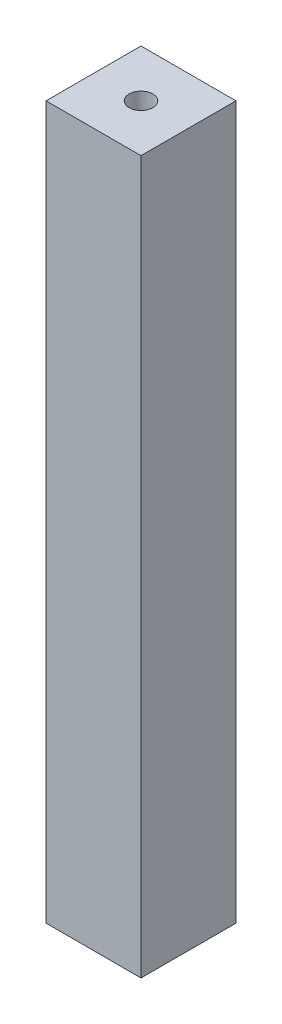
ISO-10303-21;
HEADER;
FILE_DESCRIPTION(('STEP AP214'),'2;1');
FILE_NAME('part.step','',(''),(''),'','','');
FILE_SCHEMA(('AUTOMOTIVE_DESIGN { 1 0 10303 214 1 1 1 1 }'));
ENDSEC;
DATA;
#1=APPLICATION_CONTEXT('core data for automotive mechanical design processes');
#2=APPLICATION_PROTOCOL_DEFINITION('international standard','automotive_design',2000,#1);
#3=PRODUCT_CONTEXT('',#1,'mechanical');
#4=PRODUCT('Part','Part','',(#3));
#5=PRODUCT_RELATED_PRODUCT_CATEGORY('part','',(#4));
#6=PRODUCT_DEFINITION_FORMATION('','',#4);
#7=PRODUCT_DEFINITION_CONTEXT('part definition',#1,'design');
#8=PRODUCT_DEFINITION('design','',#6,#7);
#9=PRODUCT_DEFINITION_SHAPE('','',#8);
#10=(LENGTH_UNIT() NAMED_UNIT(*) SI_UNIT(.MILLI.,.METRE.));
#11=(NAMED_UNIT(*) PLANE_ANGLE_UNIT() SI_UNIT($,.RADIAN.));
#12=(NAMED_UNIT(*) SI_UNIT($,.STERADIAN.) SOLID_ANGLE_UNIT());
#13=UNCERTAINTY_MEASURE_WITH_UNIT(LENGTH_MEASURE(1.E-05),#10,'distance_accuracy_value','');
#14=(GEOMETRIC_REPRESENTATION_CONTEXT(3) GLOBAL_UNCERTAINTY_ASSIGNED_CONTEXT((#13)) GLOBAL_UNIT_ASSIGNED_CONTEXT((#10,
#11,#12)) REPRESENTATION_CONTEXT('',''));
#15=CARTESIAN_POINT('',(0.,0.,0.));
#16=DIRECTION('',(0.,0.,1.));
#17=DIRECTION('',(1.,0.,0.));
#18=AXIS2_PLACEMENT_3D('',#15,#16,#17);
#19=CARTESIAN_POINT('',(0.,150.,0.));
#20=DIRECTION('',(0.,-1.,0.));
#21=DIRECTION('',(0.,0.,-1.));
#22=AXIS2_PLACEMENT_3D('',#19,#20,#21);
#23=PLANE('',#22);
#24=DIRECTION('',(0.,0.,-1.));
#25=VECTOR('',#24,1.);
#26=CARTESIAN_POINT('',(10.,150.,10.));
#27=LINE('',#26,#25);
#28=CARTESIAN_POINT('',(10.,150.,10.));
#29=VERTEX_POINT('',#28);
#30=CARTESIAN_POINT('',(10.,150.,-10.));
#31=VERTEX_POINT('',#30);
#32=EDGE_CURVE('E87',#29,#31,#27,.T.);
#33=ORIENTED_EDGE('',*,*,#32,.T.);
#34=DIRECTION('',(-1.,0.,0.));
#35=VECTOR('',#34,1.);
#36=CARTESIAN_POINT('',(-10.,150.,-10.));
#37=LINE('',#36,#35);
#38=CARTESIAN_POINT('',(-10.,150.,-10.));
#39=VERTEX_POINT('',#38);
#40=EDGE_CURVE('E82',#31,#39,#37,.T.);
#41=ORIENTED_EDGE('',*,*,#40,.T.);
#42=DIRECTION('',(0.,0.,1.));
#43=VECTOR('',#42,1.);
#44=CARTESIAN_POINT('',(-10.,150.,10.));
#45=LINE('',#44,#43);
#46=CARTESIAN_POINT('',(-10.,150.,10.));
#47=VERTEX_POINT('',#46);
#48=EDGE_CURVE('E85',#39,#47,#45,.T.);
#49=ORIENTED_EDGE('',*,*,#48,.T.);
#50=DIRECTION('',(1.,0.,0.));
#51=VECTOR('',#50,1.);
#52=CARTESIAN_POINT('',(-10.,150.,10.));
#53=LINE('',#52,#51);
#54=EDGE_CURVE('E52',#47,#29,#53,.T.);
#55=ORIENTED_EDGE('',*,*,#54,.T.);
#56=EDGE_LOOP('',(#33,#41,#49,#55));
#57=FACE_BOUND('',#56,.T.);
#58=CARTESIAN_POINT('',(0.,150.,0.));
#59=DIRECTION('',(0.,1.,0.));
#60=DIRECTION('',(0.,0.,1.));
#61=AXIS2_PLACEMENT_3D('',#58,#59,#60);
#62=CIRCLE('',#61,2.5);
#63=CARTESIAN_POINT('',(0.,150.,2.5));
#64=VERTEX_POINT('',#63);
#65=EDGE_CURVE('E102',#64,#64,#62,.T.);
#66=ORIENTED_EDGE('',*,*,#65,.F.);
#67=EDGE_LOOP('',(#66));
#68=FACE_BOUND('',#67,.T.);
#69=ADVANCED_FACE('F35',(#57,#68),#23,.F.);
#70=CARTESIAN_POINT('',(0.,0.,0.));
#71=DIRECTION('',(0.,-1.,0.));
#72=DIRECTION('',(0.,0.,-1.));
#73=AXIS2_PLACEMENT_3D('',#70,#71,#72);
#74=PLANE('',#73);
#75=DIRECTION('',(0.,0.,-1.));
#76=VECTOR('',#75,1.);
#77=CARTESIAN_POINT('',(10.,0.,10.));
#78=LINE('',#77,#76);
#79=CARTESIAN_POINT('',(10.,0.,10.));
#80=VERTEX_POINT('',#79);
#81=CARTESIAN_POINT('',(10.,0.,-10.));
#82=VERTEX_POINT('',#81);
#83=EDGE_CURVE('E99',#80,#82,#78,.T.);
#84=ORIENTED_EDGE('',*,*,#83,.F.);
#85=DIRECTION('',(1.,0.,0.));
#86=VECTOR('',#85,1.);
#87=CARTESIAN_POINT('',(-10.,0.,10.));
#88=LINE('',#87,#86);
#89=CARTESIAN_POINT('',(-10.,0.,10.));
#90=VERTEX_POINT('',#89);
#91=EDGE_CURVE('E75',#90,#80,#88,.T.);
#92=ORIENTED_EDGE('',*,*,#91,.F.);
#93=DIRECTION('',(0.,0.,1.));
#94=VECTOR('',#93,1.);
#95=CARTESIAN_POINT('',(-10.,0.,10.));
#96=LINE('',#95,#94);
#97=CARTESIAN_POINT('',(-10.,0.,-10.));
#98=VERTEX_POINT('',#97);
#99=EDGE_CURVE('E69',#98,#90,#96,.T.);
#100=ORIENTED_EDGE('',*,*,#99,.F.);
#101=DIRECTION('',(-1.,0.,0.));
#102=VECTOR('',#101,1.);
#103=CARTESIAN_POINT('',(-10.,0.,-10.));
#104=LINE('',#103,#102);
#105=EDGE_CURVE('E91',#82,#98,#104,.T.);
#106=ORIENTED_EDGE('',*,*,#105,.F.);
#107=EDGE_LOOP('',(#84,#92,#100,#106));
#108=FACE_BOUND('',#107,.T.);
#109=CARTESIAN_POINT('',(0.,0.,0.));
#110=DIRECTION('',(0.,1.,0.));
#111=DIRECTION('',(0.,0.,1.));
#112=AXIS2_PLACEMENT_3D('',#109,#110,#111);
#113=CIRCLE('',#112,2.5);
#114=CARTESIAN_POINT('',(0.,0.,2.5));
#115=VERTEX_POINT('',#114);
#116=EDGE_CURVE('E114',#115,#115,#113,.T.);
#117=ORIENTED_EDGE('',*,*,#116,.T.);
#118=EDGE_LOOP('',(#117));
#119=FACE_BOUND('',#118,.T.);
#120=ADVANCED_FACE('F110',(#108,#119),#74,.T.);
#121=CARTESIAN_POINT('',(10.,150.,10.));
#122=DIRECTION('',(-1.,0.,0.));
#123=DIRECTION('',(0.,0.,1.));
#124=AXIS2_PLACEMENT_3D('',#121,#122,#123);
#125=PLANE('',#124);
#126=ORIENTED_EDGE('',*,*,#83,.T.);
#127=DIRECTION('',(0.,-1.,0.));
#128=VECTOR('',#127,1.);
#129=CARTESIAN_POINT('',(10.,150.,-10.));
#130=LINE('',#129,#128);
#131=EDGE_CURVE('E11',#31,#82,#130,.T.);
#132=ORIENTED_EDGE('',*,*,#131,.F.);
#133=ORIENTED_EDGE('',*,*,#32,.F.);
#134=DIRECTION('',(0.,-1.,0.));
#135=VECTOR('',#134,1.);
#136=CARTESIAN_POINT('',(10.,150.,10.));
#137=LINE('',#136,#135);
#138=EDGE_CURVE('E95',#29,#80,#137,.T.);
#139=ORIENTED_EDGE('',*,*,#138,.T.);
#140=EDGE_LOOP('',(#126,#132,#133,#139));
#141=FACE_BOUND('',#140,.T.);
#142=ADVANCED_FACE('F37',(#141),#125,.F.);
#143=CARTESIAN_POINT('',(-10.,150.,-10.));
#144=DIRECTION('',(0.,0.,1.));
#145=DIRECTION('',(1.,0.,0.));
#146=AXIS2_PLACEMENT_3D('',#143,#144,#145);
#147=PLANE('',#146);
#148=ORIENTED_EDGE('',*,*,#105,.T.);
#149=DIRECTION('',(0.,-1.,0.));
#150=VECTOR('',#149,1.);
#151=CARTESIAN_POINT('',(-10.,150.,-10.));
#152=LINE('',#151,#150);
#153=EDGE_CURVE('E44',#39,#98,#152,.T.);
#154=ORIENTED_EDGE('',*,*,#153,.F.);
#155=ORIENTED_EDGE('',*,*,#40,.F.);
#156=ORIENTED_EDGE('',*,*,#131,.T.);
#157=EDGE_LOOP('',(#148,#154,#155,#156));
#158=FACE_BOUND('',#157,.T.);
#159=ADVANCED_FACE('F90',(#158),#147,.F.);
#160=CARTESIAN_POINT('',(-10.,150.,10.));
#161=DIRECTION('',(1.,0.,0.));
#162=DIRECTION('',(0.,0.,-1.));
#163=AXIS2_PLACEMENT_3D('',#160,#161,#162);
#164=PLANE('',#163);
#165=ORIENTED_EDGE('',*,*,#99,.T.);
#166=DIRECTION('',(0.,-1.,0.));
#167=VECTOR('',#166,1.);
#168=CARTESIAN_POINT('',(-10.,150.,10.));
#169=LINE('',#168,#167);
#170=EDGE_CURVE('E92',#47,#90,#169,.T.);
#171=ORIENTED_EDGE('',*,*,#170,.F.);
#172=ORIENTED_EDGE('',*,*,#48,.F.);
#173=ORIENTED_EDGE('',*,*,#153,.T.);
#174=EDGE_LOOP('',(#165,#171,#172,#173));
#175=FACE_BOUND('',#174,.T.);
#176=ADVANCED_FACE('F93',(#175),#164,.F.);
#177=CARTESIAN_POINT('',(-10.,150.,10.));
#178=DIRECTION('',(0.,0.,-1.));
#179=DIRECTION('',(-1.,0.,0.));
#180=AXIS2_PLACEMENT_3D('',#177,#178,#179);
#181=PLANE('',#180);
#182=ORIENTED_EDGE('',*,*,#91,.T.);
#183=ORIENTED_EDGE('',*,*,#138,.F.);
#184=ORIENTED_EDGE('',*,*,#54,.F.);
#185=ORIENTED_EDGE('',*,*,#170,.T.);
#186=EDGE_LOOP('',(#182,#183,#184,#185));
#187=FACE_BOUND('',#186,.T.);
#188=ADVANCED_FACE('F107',(#187),#181,.F.);
#189=CARTESIAN_POINT('',(0.,150.,0.));
#190=DIRECTION('',(0.,-1.,0.));
#191=DIRECTION('',(0.,0.,-1.));
#192=AXIS2_PLACEMENT_3D('',#189,#190,#191);
#193=CYLINDRICAL_SURFACE('',#192,2.5);
#194=ORIENTED_EDGE('',*,*,#65,.T.);
#195=EDGE_LOOP('',(#194));
#196=FACE_BOUND('',#195,.T.);
#197=ORIENTED_EDGE('',*,*,#116,.F.);
#198=EDGE_LOOP('',(#197));
#199=FACE_BOUND('',#198,.T.);
#200=ADVANCED_FACE('F120',(#196,#199),#193,.F.);
#201=CLOSED_SHELL('',(#69,#120,#142,#159,#176,#188,#200));
#202=MANIFOLD_SOLID_BREP('B2',#201);
#203=ADVANCED_BREP_SHAPE_REPRESENTATION('',(#18,#202),#14);
#204=SHAPE_DEFINITION_REPRESENTATION(#9,#203);
ENDSEC;
END-ISO-10303-21;
